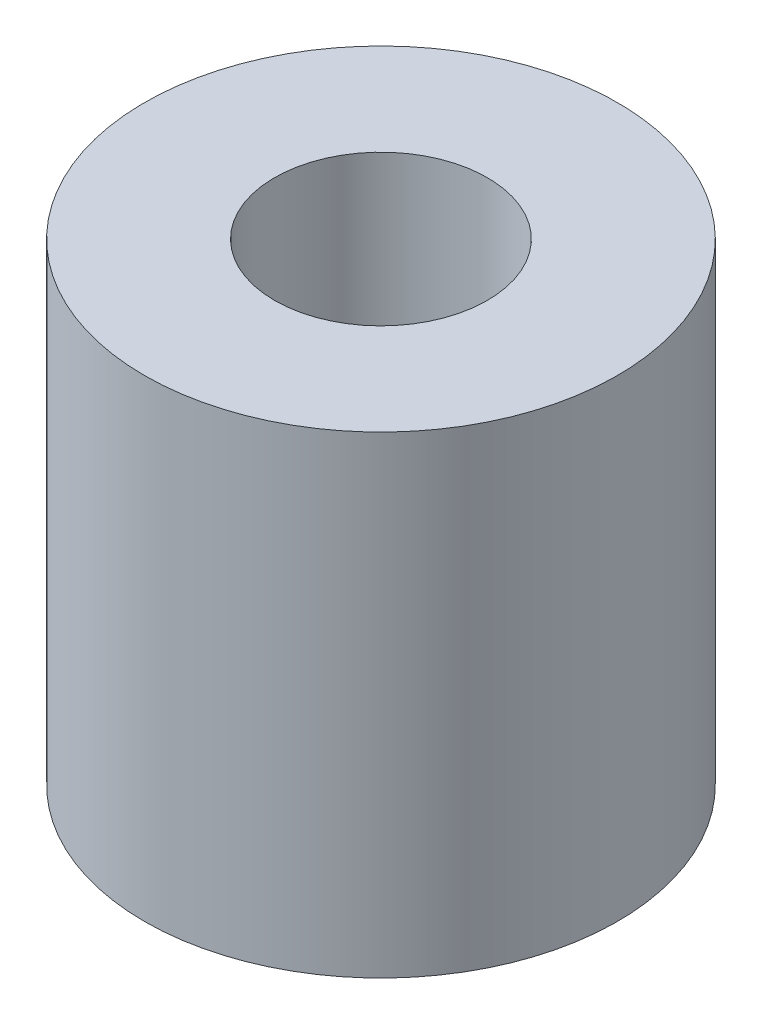
ISO-10303-21;
HEADER;
FILE_DESCRIPTION(('STEP AP214'),'2;1');
FILE_NAME('part.step','',(''),(''),'','','');
FILE_SCHEMA(('AUTOMOTIVE_DESIGN { 1 0 10303 214 1 1 1 1 }'));
ENDSEC;
DATA;
#1=APPLICATION_CONTEXT('core data for automotive mechanical design processes');
#2=APPLICATION_PROTOCOL_DEFINITION('international standard','automotive_design',2000,#1);
#3=PRODUCT_CONTEXT('',#1,'mechanical');
#4=PRODUCT('Part','Part','',(#3));
#5=PRODUCT_RELATED_PRODUCT_CATEGORY('part','',(#4));
#6=PRODUCT_DEFINITION_FORMATION('','',#4);
#7=PRODUCT_DEFINITION_CONTEXT('part definition',#1,'design');
#8=PRODUCT_DEFINITION('design','',#6,#7);
#9=PRODUCT_DEFINITION_SHAPE('','',#8);
#10=(LENGTH_UNIT() NAMED_UNIT(*) SI_UNIT(.MILLI.,.METRE.));
#11=(NAMED_UNIT(*) PLANE_ANGLE_UNIT() SI_UNIT($,.RADIAN.));
#12=(NAMED_UNIT(*) SI_UNIT($,.STERADIAN.) SOLID_ANGLE_UNIT());
#13=UNCERTAINTY_MEASURE_WITH_UNIT(LENGTH_MEASURE(1.E-05),#10,'distance_accuracy_value','');
#14=(GEOMETRIC_REPRESENTATION_CONTEXT(3) GLOBAL_UNCERTAINTY_ASSIGNED_CONTEXT((#13)) GLOBAL_UNIT_ASSIGNED_CONTEXT((#10,
#11,#12)) REPRESENTATION_CONTEXT('',''));
#15=CARTESIAN_POINT('',(0.,0.,0.));
#16=DIRECTION('',(0.,0.,1.));
#17=DIRECTION('',(1.,0.,0.));
#18=AXIS2_PLACEMENT_3D('',#15,#16,#17);
#19=CARTESIAN_POINT('',(0.,20.,0.));
#20=DIRECTION('',(0.,1.,0.));
#21=DIRECTION('',(0.,0.,1.));
#22=AXIS2_PLACEMENT_3D('',#19,#20,#21);
#23=PLANE('',#22);
#24=CARTESIAN_POINT('',(0.,20.,0.));
#25=DIRECTION('',(0.,1.,0.));
#26=DIRECTION('',(0.,0.,1.));
#27=AXIS2_PLACEMENT_3D('',#24,#25,#26);
#28=CIRCLE('',#27,10.);
#29=CARTESIAN_POINT('',(0.,20.,10.));
#30=VERTEX_POINT('',#29);
#31=EDGE_CURVE('E10',#30,#30,#28,.T.);
#32=ORIENTED_EDGE('',*,*,#31,.T.);
#33=EDGE_LOOP('',(#32));
#34=FACE_BOUND('',#33,.T.);
#35=CARTESIAN_POINT('',(0.,20.,0.));
#36=DIRECTION('',(0.,1.,0.));
#37=DIRECTION('',(0.,0.,1.));
#38=AXIS2_PLACEMENT_3D('',#35,#36,#37);
#39=CIRCLE('',#38,4.5);
#40=CARTESIAN_POINT('',(0.,20.,4.5));
#41=VERTEX_POINT('',#40);
#42=EDGE_CURVE('E56',#41,#41,#39,.T.);
#43=ORIENTED_EDGE('',*,*,#42,.F.);
#44=EDGE_LOOP('',(#43));
#45=FACE_BOUND('',#44,.T.);
#46=ADVANCED_FACE('F43',(#34,#45),#23,.T.);
#47=CARTESIAN_POINT('',(0.,0.,0.));
#48=DIRECTION('',(0.,1.,0.));
#49=DIRECTION('',(0.,0.,1.));
#50=AXIS2_PLACEMENT_3D('',#47,#48,#49);
#51=PLANE('',#50);
#52=CARTESIAN_POINT('',(-6.53202429229253,0.,3.1456571086023));
#53=DIRECTION('',(0.,-1.,0.));
#54=DIRECTION('',(0.,0.,-1.));
#55=AXIS2_PLACEMENT_3D('',#52,#53,#54);
#56=CIRCLE('',#55,0.999999999999999);
#57=CARTESIAN_POINT('',(-6.53202429229253,0.,2.1456571086023));
#58=VERTEX_POINT('',#57);
#59=EDGE_CURVE('E70',#58,#58,#56,.T.);
#60=ORIENTED_EDGE('',*,*,#59,.F.);
#61=EDGE_LOOP('',(#60));
#62=FACE_BOUND('',#61,.T.);
#63=CARTESIAN_POINT('',(-4.52030106347581,0.,5.66827824789323));
#64=DIRECTION('',(0.,-1.,0.));
#65=DIRECTION('',(0.,0.,-1.));
#66=AXIS2_PLACEMENT_3D('',#63,#64,#65);
#67=CIRCLE('',#66,1.);
#68=CARTESIAN_POINT('',(-4.52030106347581,0.,4.66827824789322));
#69=VERTEX_POINT('',#68);
#70=EDGE_CURVE('E127',#69,#69,#67,.T.);
#71=ORIENTED_EDGE('',*,*,#70,.F.);
#72=EDGE_LOOP('',(#71));
#73=FACE_BOUND('',#72,.T.);
#74=CARTESIAN_POINT('',(-1.61327677118326,0.,7.06822736331823));
#75=DIRECTION('',(0.,-1.,0.));
#76=DIRECTION('',(0.,0.,-1.));
#77=AXIS2_PLACEMENT_3D('',#74,#75,#76);
#78=CIRCLE('',#77,0.999999999999999);
#79=CARTESIAN_POINT('',(-1.61327677118326,0.,6.06822736331823));
#80=VERTEX_POINT('',#79);
#81=EDGE_CURVE('E119',#80,#80,#78,.T.);
#82=ORIENTED_EDGE('',*,*,#81,.F.);
#83=EDGE_LOOP('',(#82));
#84=FACE_BOUND('',#83,.T.);
#85=CARTESIAN_POINT('',(1.61327677118331,0.,7.06822736331821));
#86=DIRECTION('',(0.,-1.,0.));
#87=DIRECTION('',(0.,0.,-1.));
#88=AXIS2_PLACEMENT_3D('',#85,#86,#87);
#89=CIRCLE('',#88,0.999999999999999);
#90=CARTESIAN_POINT('',(1.61327677118331,0.,6.06822736331821));
#91=VERTEX_POINT('',#90);
#92=EDGE_CURVE('E111',#91,#91,#89,.T.);
#93=ORIENTED_EDGE('',*,*,#92,.F.);
#94=EDGE_LOOP('',(#93));
#95=FACE_BOUND('',#94,.T.);
#96=CARTESIAN_POINT('',(4.52030106347584,0.,5.66827824789319));
#97=DIRECTION('',(0.,-1.,0.));
#98=DIRECTION('',(0.,0.,-1.));
#99=AXIS2_PLACEMENT_3D('',#96,#97,#98);
#100=CIRCLE('',#99,0.999999999999999);
#101=CARTESIAN_POINT('',(4.52030106347584,0.,4.66827824789319));
#102=VERTEX_POINT('',#101);
#103=EDGE_CURVE('E103',#102,#102,#100,.T.);
#104=ORIENTED_EDGE('',*,*,#103,.F.);
#105=EDGE_LOOP('',(#104));
#106=FACE_BOUND('',#105,.T.);
#107=CARTESIAN_POINT('',(6.53202429229256,0.,3.14565710860226));
#108=DIRECTION('',(0.,-1.,0.));
#109=DIRECTION('',(0.,0.,-1.));
#110=AXIS2_PLACEMENT_3D('',#107,#108,#109);
#111=CIRCLE('',#110,1.);
#112=CARTESIAN_POINT('',(6.53202429229256,0.,2.14565710860226));
#113=VERTEX_POINT('',#112);
#114=EDGE_CURVE('E95',#113,#113,#111,.T.);
#115=ORIENTED_EDGE('',*,*,#114,.F.);
#116=EDGE_LOOP('',(#115));
#117=FACE_BOUND('',#116,.T.);
#118=CARTESIAN_POINT('',(7.25,0.,0.));
#119=DIRECTION('',(0.,-1.,0.));
#120=DIRECTION('',(0.,0.,-1.));
#121=AXIS2_PLACEMENT_3D('',#118,#119,#120);
#122=CIRCLE('',#121,0.999999999999999);
#123=CARTESIAN_POINT('',(7.25,0.,-1.00000000000005));
#124=VERTEX_POINT('',#123);
#125=EDGE_CURVE('E87',#124,#124,#122,.T.);
#126=ORIENTED_EDGE('',*,*,#125,.F.);
#127=EDGE_LOOP('',(#126));
#128=FACE_BOUND('',#127,.T.);
#129=CARTESIAN_POINT('',(6.53202429229251,0.,-3.14565710860235));
#130=DIRECTION('',(0.,-1.,0.));
#131=DIRECTION('',(0.,0.,-1.));
#132=AXIS2_PLACEMENT_3D('',#129,#130,#131);
#133=CIRCLE('',#132,0.999999999999999);
#134=CARTESIAN_POINT('',(6.53202429229251,0.,-4.14565710860235));
#135=VERTEX_POINT('',#134);
#136=EDGE_CURVE('E78',#135,#135,#133,.T.);
#137=ORIENTED_EDGE('',*,*,#136,.F.);
#138=EDGE_LOOP('',(#137));
#139=FACE_BOUND('',#138,.T.);
#140=CARTESIAN_POINT('',(4.52030106347577,0.,-5.66827824789325));
#141=DIRECTION('',(0.,-1.,0.));
#142=DIRECTION('',(0.,0.,-1.));
#143=AXIS2_PLACEMENT_3D('',#140,#141,#142);
#144=CIRCLE('',#143,1.);
#145=CARTESIAN_POINT('',(4.52030106347577,0.,-6.66827824789325));
#146=VERTEX_POINT('',#145);
#147=EDGE_CURVE('E79',#146,#146,#144,.T.);
#148=ORIENTED_EDGE('',*,*,#147,.F.);
#149=EDGE_LOOP('',(#148));
#150=FACE_BOUND('',#149,.T.);
#151=CARTESIAN_POINT('',(1.61327677118321,0.,-7.06822736331824));
#152=DIRECTION('',(0.,-1.,0.));
#153=DIRECTION('',(0.,0.,-1.));
#154=AXIS2_PLACEMENT_3D('',#151,#152,#153);
#155=CIRCLE('',#154,1.);
#156=CARTESIAN_POINT('',(1.61327677118321,0.,-8.06822736331824));
#157=VERTEX_POINT('',#156);
#158=EDGE_CURVE('E166',#157,#157,#155,.T.);
#159=ORIENTED_EDGE('',*,*,#158,.F.);
#160=EDGE_LOOP('',(#159));
#161=FACE_BOUND('',#160,.T.);
#162=CARTESIAN_POINT('',(-1.61327677118335,0.,-7.0682273633182));
#163=DIRECTION('',(0.,-1.,0.));
#164=DIRECTION('',(0.,0.,-1.));
#165=AXIS2_PLACEMENT_3D('',#162,#163,#164);
#166=CIRCLE('',#165,1.);
#167=CARTESIAN_POINT('',(-1.61327677118335,0.,-8.0682273633182));
#168=VERTEX_POINT('',#167);
#169=EDGE_CURVE('E158',#168,#168,#166,.T.);
#170=ORIENTED_EDGE('',*,*,#169,.F.);
#171=EDGE_LOOP('',(#170));
#172=FACE_BOUND('',#171,.T.);
#173=CARTESIAN_POINT('',(-4.52030106347589,0.,-5.66827824789316));
#174=DIRECTION('',(0.,-1.,0.));
#175=DIRECTION('',(0.,0.,-1.));
#176=AXIS2_PLACEMENT_3D('',#173,#174,#175);
#177=CIRCLE('',#176,0.999999999999998);
#178=CARTESIAN_POINT('',(-4.52030106347589,0.,-6.66827824789316));
#179=VERTEX_POINT('',#178);
#180=EDGE_CURVE('E150',#179,#179,#177,.T.);
#181=ORIENTED_EDGE('',*,*,#180,.F.);
#182=EDGE_LOOP('',(#181));
#183=FACE_BOUND('',#182,.T.);
#184=CARTESIAN_POINT('',(-6.53202429229258,0.,-3.14565710860221));
#185=DIRECTION('',(0.,-1.,0.));
#186=DIRECTION('',(0.,0.,-1.));
#187=AXIS2_PLACEMENT_3D('',#184,#185,#186);
#188=CIRCLE('',#187,0.999999999999999);
#189=CARTESIAN_POINT('',(-6.53202429229258,0.,-4.14565710860221));
#190=VERTEX_POINT('',#189);
#191=EDGE_CURVE('E142',#190,#190,#188,.T.);
#192=ORIENTED_EDGE('',*,*,#191,.F.);
#193=EDGE_LOOP('',(#192));
#194=FACE_BOUND('',#193,.T.);
#195=CARTESIAN_POINT('',(-7.25,0.,0.));
#196=DIRECTION('',(0.,-1.,0.));
#197=DIRECTION('',(0.,0.,-1.));
#198=AXIS2_PLACEMENT_3D('',#195,#196,#197);
#199=CIRCLE('',#198,1.);
#200=CARTESIAN_POINT('',(-7.25,0.,-1.));
#201=VERTEX_POINT('',#200);
#202=EDGE_CURVE('E66',#201,#201,#199,.T.);
#203=ORIENTED_EDGE('',*,*,#202,.F.);
#204=EDGE_LOOP('',(#203));
#205=FACE_BOUND('',#204,.T.);
#206=CARTESIAN_POINT('',(0.,0.,0.));
#207=DIRECTION('',(0.,1.,0.));
#208=DIRECTION('',(0.,0.,1.));
#209=AXIS2_PLACEMENT_3D('',#206,#207,#208);
#210=CIRCLE('',#209,10.);
#211=CARTESIAN_POINT('',(0.,0.,10.));
#212=VERTEX_POINT('',#211);
#213=EDGE_CURVE('E47',#212,#212,#210,.T.);
#214=ORIENTED_EDGE('',*,*,#213,.F.);
#215=EDGE_LOOP('',(#214));
#216=FACE_BOUND('',#215,.T.);
#217=CARTESIAN_POINT('',(0.,0.,0.));
#218=DIRECTION('',(0.,1.,0.));
#219=DIRECTION('',(0.,0.,1.));
#220=AXIS2_PLACEMENT_3D('',#217,#218,#219);
#221=CIRCLE('',#220,4.5);
#222=CARTESIAN_POINT('',(0.,0.,4.5));
#223=VERTEX_POINT('',#222);
#224=EDGE_CURVE('E58',#223,#223,#221,.T.);
#225=ORIENTED_EDGE('',*,*,#224,.T.);
#226=EDGE_LOOP('',(#225));
#227=FACE_BOUND('',#226,.T.);
#228=ADVANCED_FACE('F180',(#62,#73,#84,#95,#106,#117,#128,#139,#150,#161,#172,#183,#194,#205,
#216,#227),#51,.F.);
#229=CARTESIAN_POINT('',(0.,20.,0.));
#230=DIRECTION('',(0.,-1.,0.));
#231=DIRECTION('',(0.,0.,-1.));
#232=AXIS2_PLACEMENT_3D('',#229,#230,#231);
#233=CYLINDRICAL_SURFACE('',#232,10.);
#234=ORIENTED_EDGE('',*,*,#31,.F.);
#235=EDGE_LOOP('',(#234));
#236=FACE_BOUND('',#235,.T.);
#237=ORIENTED_EDGE('',*,*,#213,.T.);
#238=EDGE_LOOP('',(#237));
#239=FACE_BOUND('',#238,.T.);
#240=ADVANCED_FACE('F45',(#236,#239),#233,.T.);
#241=CARTESIAN_POINT('',(0.,20.,0.));
#242=DIRECTION('',(0.,-1.,0.));
#243=DIRECTION('',(0.,0.,-1.));
#244=AXIS2_PLACEMENT_3D('',#241,#242,#243);
#245=CYLINDRICAL_SURFACE('',#244,4.5);
#246=ORIENTED_EDGE('',*,*,#42,.T.);
#247=EDGE_LOOP('',(#246));
#248=FACE_BOUND('',#247,.T.);
#249=ORIENTED_EDGE('',*,*,#224,.F.);
#250=EDGE_LOOP('',(#249));
#251=FACE_BOUND('',#250,.T.);
#252=ADVANCED_FACE('F198',(#248,#251),#245,.F.);
#253=CARTESIAN_POINT('',(-7.25,2.,0.));
#254=DIRECTION('',(0.,-1.,0.));
#255=DIRECTION('',(0.,0.,-1.));
#256=AXIS2_PLACEMENT_3D('',#253,#254,#255);
#257=CYLINDRICAL_SURFACE('',#256,1.);
#258=CARTESIAN_POINT('',(-7.25,2.,0.));
#259=DIRECTION('',(0.,-1.,0.));
#260=DIRECTION('',(0.,0.,-1.));
#261=AXIS2_PLACEMENT_3D('',#258,#259,#260);
#262=CIRCLE('',#261,1.);
#263=CARTESIAN_POINT('',(-7.25,2.,-1.));
#264=VERTEX_POINT('',#263);
#265=EDGE_CURVE('E62',#264,#264,#262,.T.);
#266=ORIENTED_EDGE('',*,*,#265,.F.);
#267=EDGE_LOOP('',(#266));
#268=FACE_BOUND('',#267,.T.);
#269=ORIENTED_EDGE('',*,*,#202,.T.);
#270=EDGE_LOOP('',(#269));
#271=FACE_BOUND('',#270,.T.);
#272=ADVANCED_FACE('F200',(#268,#271),#257,.F.);
#273=CARTESIAN_POINT('',(-7.25,2.,0.));
#274=DIRECTION('',(0.,-1.,0.));
#275=DIRECTION('',(0.,0.,-1.));
#276=AXIS2_PLACEMENT_3D('',#273,#274,#275);
#277=PLANE('',#276);
#278=ORIENTED_EDGE('',*,*,#265,.T.);
#279=EDGE_LOOP('',(#278));
#280=FACE_BOUND('',#279,.T.);
#281=ADVANCED_FACE('F207',(#280),#277,.T.);
#282=CARTESIAN_POINT('',(-6.53202429229258,2.,-3.14565710860221));
#283=DIRECTION('',(0.,-1.,0.));
#284=DIRECTION('',(0.,0.,-1.));
#285=AXIS2_PLACEMENT_3D('',#282,#283,#284);
#286=CYLINDRICAL_SURFACE('',#285,0.999999999999999);
#287=CARTESIAN_POINT('',(-6.53202429229258,2.,-3.14565710860221));
#288=DIRECTION('',(0.,-1.,0.));
#289=DIRECTION('',(0.,0.,-1.));
#290=AXIS2_PLACEMENT_3D('',#287,#288,#289);
#291=CIRCLE('',#290,0.999999999999999);
#292=CARTESIAN_POINT('',(-6.53202429229258,2.,-4.14565710860221));
#293=VERTEX_POINT('',#292);
#294=EDGE_CURVE('E138',#293,#293,#291,.T.);
#295=ORIENTED_EDGE('',*,*,#294,.F.);
#296=EDGE_LOOP('',(#295));
#297=FACE_BOUND('',#296,.T.);
#298=ORIENTED_EDGE('',*,*,#191,.T.);
#299=EDGE_LOOP('',(#298));
#300=FACE_BOUND('',#299,.T.);
#301=ADVANCED_FACE('F246',(#297,#300),#286,.F.);
#302=CARTESIAN_POINT('',(-6.53202429229258,2.,-3.14565710860221));
#303=DIRECTION('',(0.,-1.,0.));
#304=DIRECTION('',(0.,0.,-1.));
#305=AXIS2_PLACEMENT_3D('',#302,#303,#304);
#306=PLANE('',#305);
#307=ORIENTED_EDGE('',*,*,#294,.T.);
#308=EDGE_LOOP('',(#307));
#309=FACE_BOUND('',#308,.T.);
#310=ADVANCED_FACE('F256',(#309),#306,.T.);
#311=CARTESIAN_POINT('',(-4.52030106347589,2.,-5.66827824789316));
#312=DIRECTION('',(0.,-1.,0.));
#313=DIRECTION('',(0.,0.,-1.));
#314=AXIS2_PLACEMENT_3D('',#311,#312,#313);
#315=CYLINDRICAL_SURFACE('',#314,0.999999999999998);
#316=CARTESIAN_POINT('',(-4.52030106347589,2.,-5.66827824789316));
#317=DIRECTION('',(0.,-1.,0.));
#318=DIRECTION('',(0.,0.,-1.));
#319=AXIS2_PLACEMENT_3D('',#316,#317,#318);
#320=CIRCLE('',#319,0.999999999999998);
#321=CARTESIAN_POINT('',(-4.52030106347589,2.,-6.66827824789316));
#322=VERTEX_POINT('',#321);
#323=EDGE_CURVE('E146',#322,#322,#320,.T.);
#324=ORIENTED_EDGE('',*,*,#323,.F.);
#325=EDGE_LOOP('',(#324));
#326=FACE_BOUND('',#325,.T.);
#327=ORIENTED_EDGE('',*,*,#180,.T.);
#328=EDGE_LOOP('',(#327));
#329=FACE_BOUND('',#328,.T.);
#330=ADVANCED_FACE('F266',(#326,#329),#315,.F.);
#331=CARTESIAN_POINT('',(-4.52030106347589,2.,-5.66827824789316));
#332=DIRECTION('',(0.,-1.,0.));
#333=DIRECTION('',(0.,0.,-1.));
#334=AXIS2_PLACEMENT_3D('',#331,#332,#333);
#335=PLANE('',#334);
#336=ORIENTED_EDGE('',*,*,#323,.T.);
#337=EDGE_LOOP('',(#336));
#338=FACE_BOUND('',#337,.T.);
#339=ADVANCED_FACE('F276',(#338),#335,.T.);
#340=CARTESIAN_POINT('',(-1.61327677118335,2.,-7.0682273633182));
#341=DIRECTION('',(0.,-1.,0.));
#342=DIRECTION('',(0.,0.,-1.));
#343=AXIS2_PLACEMENT_3D('',#340,#341,#342);
#344=CYLINDRICAL_SURFACE('',#343,1.);
#345=CARTESIAN_POINT('',(-1.61327677118335,2.,-7.0682273633182));
#346=DIRECTION('',(0.,-1.,0.));
#347=DIRECTION('',(0.,0.,-1.));
#348=AXIS2_PLACEMENT_3D('',#345,#346,#347);
#349=CIRCLE('',#348,1.);
#350=CARTESIAN_POINT('',(-1.61327677118335,2.,-8.0682273633182));
#351=VERTEX_POINT('',#350);
#352=EDGE_CURVE('E154',#351,#351,#349,.T.);
#353=ORIENTED_EDGE('',*,*,#352,.F.);
#354=EDGE_LOOP('',(#353));
#355=FACE_BOUND('',#354,.T.);
#356=ORIENTED_EDGE('',*,*,#169,.T.);
#357=EDGE_LOOP('',(#356));
#358=FACE_BOUND('',#357,.T.);
#359=ADVANCED_FACE('F286',(#355,#358),#344,.F.);
#360=CARTESIAN_POINT('',(-1.61327677118335,2.,-7.0682273633182));
#361=DIRECTION('',(0.,-1.,0.));
#362=DIRECTION('',(0.,0.,-1.));
#363=AXIS2_PLACEMENT_3D('',#360,#361,#362);
#364=PLANE('',#363);
#365=ORIENTED_EDGE('',*,*,#352,.T.);
#366=EDGE_LOOP('',(#365));
#367=FACE_BOUND('',#366,.T.);
#368=ADVANCED_FACE('F296',(#367),#364,.T.);
#369=CARTESIAN_POINT('',(1.61327677118321,2.,-7.06822736331824));
#370=DIRECTION('',(0.,-1.,0.));
#371=DIRECTION('',(0.,0.,-1.));
#372=AXIS2_PLACEMENT_3D('',#369,#370,#371);
#373=CYLINDRICAL_SURFACE('',#372,1.);
#374=CARTESIAN_POINT('',(1.61327677118321,2.,-7.06822736331824));
#375=DIRECTION('',(0.,-1.,0.));
#376=DIRECTION('',(0.,0.,-1.));
#377=AXIS2_PLACEMENT_3D('',#374,#375,#376);
#378=CIRCLE('',#377,1.);
#379=CARTESIAN_POINT('',(1.61327677118321,2.,-8.06822736331824));
#380=VERTEX_POINT('',#379);
#381=EDGE_CURVE('E162',#380,#380,#378,.T.);
#382=ORIENTED_EDGE('',*,*,#381,.F.);
#383=EDGE_LOOP('',(#382));
#384=FACE_BOUND('',#383,.T.);
#385=ORIENTED_EDGE('',*,*,#158,.T.);
#386=EDGE_LOOP('',(#385));
#387=FACE_BOUND('',#386,.T.);
#388=ADVANCED_FACE('F306',(#384,#387),#373,.F.);
#389=CARTESIAN_POINT('',(1.61327677118321,2.,-7.06822736331824));
#390=DIRECTION('',(0.,-1.,0.));
#391=DIRECTION('',(0.,0.,-1.));
#392=AXIS2_PLACEMENT_3D('',#389,#390,#391);
#393=PLANE('',#392);
#394=ORIENTED_EDGE('',*,*,#381,.T.);
#395=EDGE_LOOP('',(#394));
#396=FACE_BOUND('',#395,.T.);
#397=ADVANCED_FACE('F316',(#396),#393,.T.);
#398=CARTESIAN_POINT('',(4.52030106347577,2.,-5.66827824789325));
#399=DIRECTION('',(0.,-1.,0.));
#400=DIRECTION('',(0.,0.,-1.));
#401=AXIS2_PLACEMENT_3D('',#398,#399,#400);
#402=CYLINDRICAL_SURFACE('',#401,1.);
#403=CARTESIAN_POINT('',(4.52030106347577,2.,-5.66827824789325));
#404=DIRECTION('',(0.,-1.,0.));
#405=DIRECTION('',(0.,0.,-1.));
#406=AXIS2_PLACEMENT_3D('',#403,#404,#405);
#407=CIRCLE('',#406,1.);
#408=CARTESIAN_POINT('',(4.52030106347577,2.,-6.66827824789325));
#409=VERTEX_POINT('',#408);
#410=EDGE_CURVE('E170',#409,#409,#407,.T.);
#411=ORIENTED_EDGE('',*,*,#410,.F.);
#412=EDGE_LOOP('',(#411));
#413=FACE_BOUND('',#412,.T.);
#414=ORIENTED_EDGE('',*,*,#147,.T.);
#415=EDGE_LOOP('',(#414));
#416=FACE_BOUND('',#415,.T.);
#417=ADVANCED_FACE('F178',(#413,#416),#402,.F.);
#418=CARTESIAN_POINT('',(4.52030106347577,2.,-5.66827824789325));
#419=DIRECTION('',(0.,-1.,0.));
#420=DIRECTION('',(0.,0.,-1.));
#421=AXIS2_PLACEMENT_3D('',#418,#419,#420);
#422=PLANE('',#421);
#423=ORIENTED_EDGE('',*,*,#410,.T.);
#424=EDGE_LOOP('',(#423));
#425=FACE_BOUND('',#424,.T.);
#426=ADVANCED_FACE('F335',(#425),#422,.T.);
#427=CARTESIAN_POINT('',(6.53202429229251,2.,-3.14565710860235));
#428=DIRECTION('',(0.,-1.,0.));
#429=DIRECTION('',(0.,0.,-1.));
#430=AXIS2_PLACEMENT_3D('',#427,#428,#429);
#431=CYLINDRICAL_SURFACE('',#430,0.999999999999999);
#432=CARTESIAN_POINT('',(6.53202429229251,2.,-3.14565710860235));
#433=DIRECTION('',(0.,-1.,0.));
#434=DIRECTION('',(0.,0.,-1.));
#435=AXIS2_PLACEMENT_3D('',#432,#433,#434);
#436=CIRCLE('',#435,0.999999999999999);
#437=CARTESIAN_POINT('',(6.53202429229251,2.,-4.14565710860235));
#438=VERTEX_POINT('',#437);
#439=EDGE_CURVE('E74',#438,#438,#436,.T.);
#440=ORIENTED_EDGE('',*,*,#439,.F.);
#441=EDGE_LOOP('',(#440));
#442=FACE_BOUND('',#441,.T.);
#443=ORIENTED_EDGE('',*,*,#136,.T.);
#444=EDGE_LOOP('',(#443));
#445=FACE_BOUND('',#444,.T.);
#446=ADVANCED_FACE('F345',(#442,#445),#431,.F.);
#447=CARTESIAN_POINT('',(6.53202429229251,2.,-3.14565710860235));
#448=DIRECTION('',(0.,-1.,0.));
#449=DIRECTION('',(0.,0.,-1.));
#450=AXIS2_PLACEMENT_3D('',#447,#448,#449);
#451=PLANE('',#450);
#452=ORIENTED_EDGE('',*,*,#439,.T.);
#453=EDGE_LOOP('',(#452));
#454=FACE_BOUND('',#453,.T.);
#455=ADVANCED_FACE('F355',(#454),#451,.T.);
#456=CARTESIAN_POINT('',(7.25,2.,0.));
#457=DIRECTION('',(0.,-1.,0.));
#458=DIRECTION('',(0.,0.,-1.));
#459=AXIS2_PLACEMENT_3D('',#456,#457,#458);
#460=CYLINDRICAL_SURFACE('',#459,0.999999999999999);
#461=CARTESIAN_POINT('',(7.25,2.,0.));
#462=DIRECTION('',(0.,-1.,0.));
#463=DIRECTION('',(0.,0.,-1.));
#464=AXIS2_PLACEMENT_3D('',#461,#462,#463);
#465=CIRCLE('',#464,0.999999999999999);
#466=CARTESIAN_POINT('',(7.25,2.,-1.00000000000005));
#467=VERTEX_POINT('',#466);
#468=EDGE_CURVE('E83',#467,#467,#465,.T.);
#469=ORIENTED_EDGE('',*,*,#468,.F.);
#470=EDGE_LOOP('',(#469));
#471=FACE_BOUND('',#470,.T.);
#472=ORIENTED_EDGE('',*,*,#125,.T.);
#473=EDGE_LOOP('',(#472));
#474=FACE_BOUND('',#473,.T.);
#475=ADVANCED_FACE('F365',(#471,#474),#460,.F.);
#476=CARTESIAN_POINT('',(7.25,2.,0.));
#477=DIRECTION('',(0.,-1.,0.));
#478=DIRECTION('',(0.,0.,-1.));
#479=AXIS2_PLACEMENT_3D('',#476,#477,#478);
#480=PLANE('',#479);
#481=ORIENTED_EDGE('',*,*,#468,.T.);
#482=EDGE_LOOP('',(#481));
#483=FACE_BOUND('',#482,.T.);
#484=ADVANCED_FACE('F375',(#483),#480,.T.);
#485=CARTESIAN_POINT('',(6.53202429229256,2.,3.14565710860226));
#486=DIRECTION('',(0.,-1.,0.));
#487=DIRECTION('',(0.,0.,-1.));
#488=AXIS2_PLACEMENT_3D('',#485,#486,#487);
#489=CYLINDRICAL_SURFACE('',#488,1.);
#490=CARTESIAN_POINT('',(6.53202429229256,2.,3.14565710860226));
#491=DIRECTION('',(0.,-1.,0.));
#492=DIRECTION('',(0.,0.,-1.));
#493=AXIS2_PLACEMENT_3D('',#490,#491,#492);
#494=CIRCLE('',#493,1.);
#495=CARTESIAN_POINT('',(6.53202429229256,2.,2.14565710860226));
#496=VERTEX_POINT('',#495);
#497=EDGE_CURVE('E91',#496,#496,#494,.T.);
#498=ORIENTED_EDGE('',*,*,#497,.F.);
#499=EDGE_LOOP('',(#498));
#500=FACE_BOUND('',#499,.T.);
#501=ORIENTED_EDGE('',*,*,#114,.T.);
#502=EDGE_LOOP('',(#501));
#503=FACE_BOUND('',#502,.T.);
#504=ADVANCED_FACE('F385',(#500,#503),#489,.F.);
#505=CARTESIAN_POINT('',(6.53202429229256,2.,3.14565710860226));
#506=DIRECTION('',(0.,-1.,0.));
#507=DIRECTION('',(0.,0.,-1.));
#508=AXIS2_PLACEMENT_3D('',#505,#506,#507);
#509=PLANE('',#508);
#510=ORIENTED_EDGE('',*,*,#497,.T.);
#511=EDGE_LOOP('',(#510));
#512=FACE_BOUND('',#511,.T.);
#513=ADVANCED_FACE('F395',(#512),#509,.T.);
#514=CARTESIAN_POINT('',(4.52030106347584,2.,5.66827824789319));
#515=DIRECTION('',(0.,-1.,0.));
#516=DIRECTION('',(0.,0.,-1.));
#517=AXIS2_PLACEMENT_3D('',#514,#515,#516);
#518=CYLINDRICAL_SURFACE('',#517,0.999999999999999);
#519=CARTESIAN_POINT('',(4.52030106347584,2.,5.66827824789319));
#520=DIRECTION('',(0.,-1.,0.));
#521=DIRECTION('',(0.,0.,-1.));
#522=AXIS2_PLACEMENT_3D('',#519,#520,#521);
#523=CIRCLE('',#522,0.999999999999999);
#524=CARTESIAN_POINT('',(4.52030106347584,2.,4.66827824789319));
#525=VERTEX_POINT('',#524);
#526=EDGE_CURVE('E99',#525,#525,#523,.T.);
#527=ORIENTED_EDGE('',*,*,#526,.F.);
#528=EDGE_LOOP('',(#527));
#529=FACE_BOUND('',#528,.T.);
#530=ORIENTED_EDGE('',*,*,#103,.T.);
#531=EDGE_LOOP('',(#530));
#532=FACE_BOUND('',#531,.T.);
#533=ADVANCED_FACE('F405',(#529,#532),#518,.F.);
#534=CARTESIAN_POINT('',(4.52030106347584,2.,5.66827824789319));
#535=DIRECTION('',(0.,-1.,0.));
#536=DIRECTION('',(0.,0.,-1.));
#537=AXIS2_PLACEMENT_3D('',#534,#535,#536);
#538=PLANE('',#537);
#539=ORIENTED_EDGE('',*,*,#526,.T.);
#540=EDGE_LOOP('',(#539));
#541=FACE_BOUND('',#540,.T.);
#542=ADVANCED_FACE('F415',(#541),#538,.T.);
#543=CARTESIAN_POINT('',(1.61327677118331,2.,7.06822736331821));
#544=DIRECTION('',(0.,-1.,0.));
#545=DIRECTION('',(0.,0.,-1.));
#546=AXIS2_PLACEMENT_3D('',#543,#544,#545);
#547=CYLINDRICAL_SURFACE('',#546,0.999999999999999);
#548=CARTESIAN_POINT('',(1.61327677118331,2.,7.06822736331821));
#549=DIRECTION('',(0.,-1.,0.));
#550=DIRECTION('',(0.,0.,-1.));
#551=AXIS2_PLACEMENT_3D('',#548,#549,#550);
#552=CIRCLE('',#551,0.999999999999999);
#553=CARTESIAN_POINT('',(1.61327677118331,2.,6.06822736331821));
#554=VERTEX_POINT('',#553);
#555=EDGE_CURVE('E107',#554,#554,#552,.T.);
#556=ORIENTED_EDGE('',*,*,#555,.F.);
#557=EDGE_LOOP('',(#556));
#558=FACE_BOUND('',#557,.T.);
#559=ORIENTED_EDGE('',*,*,#92,.T.);
#560=EDGE_LOOP('',(#559));
#561=FACE_BOUND('',#560,.T.);
#562=ADVANCED_FACE('F425',(#558,#561),#547,.F.);
#563=CARTESIAN_POINT('',(1.61327677118331,2.,7.06822736331821));
#564=DIRECTION('',(0.,-1.,0.));
#565=DIRECTION('',(0.,0.,-1.));
#566=AXIS2_PLACEMENT_3D('',#563,#564,#565);
#567=PLANE('',#566);
#568=ORIENTED_EDGE('',*,*,#555,.T.);
#569=EDGE_LOOP('',(#568));
#570=FACE_BOUND('',#569,.T.);
#571=ADVANCED_FACE('F435',(#570),#567,.T.);
#572=CARTESIAN_POINT('',(-1.61327677118326,2.,7.06822736331823));
#573=DIRECTION('',(0.,-1.,0.));
#574=DIRECTION('',(0.,0.,-1.));
#575=AXIS2_PLACEMENT_3D('',#572,#573,#574);
#576=CYLINDRICAL_SURFACE('',#575,0.999999999999999);
#577=CARTESIAN_POINT('',(-1.61327677118326,2.,7.06822736331823));
#578=DIRECTION('',(0.,-1.,0.));
#579=DIRECTION('',(0.,0.,-1.));
#580=AXIS2_PLACEMENT_3D('',#577,#578,#579);
#581=CIRCLE('',#580,0.999999999999999);
#582=CARTESIAN_POINT('',(-1.61327677118326,2.,6.06822736331823));
#583=VERTEX_POINT('',#582);
#584=EDGE_CURVE('E115',#583,#583,#581,.T.);
#585=ORIENTED_EDGE('',*,*,#584,.F.);
#586=EDGE_LOOP('',(#585));
#587=FACE_BOUND('',#586,.T.);
#588=ORIENTED_EDGE('',*,*,#81,.T.);
#589=EDGE_LOOP('',(#588));
#590=FACE_BOUND('',#589,.T.);
#591=ADVANCED_FACE('F445',(#587,#590),#576,.F.);
#592=CARTESIAN_POINT('',(-1.61327677118326,2.,7.06822736331823));
#593=DIRECTION('',(0.,-1.,0.));
#594=DIRECTION('',(0.,0.,-1.));
#595=AXIS2_PLACEMENT_3D('',#592,#593,#594);
#596=PLANE('',#595);
#597=ORIENTED_EDGE('',*,*,#584,.T.);
#598=EDGE_LOOP('',(#597));
#599=FACE_BOUND('',#598,.T.);
#600=ADVANCED_FACE('F455',(#599),#596,.T.);
#601=CARTESIAN_POINT('',(-4.52030106347581,2.,5.66827824789323));
#602=DIRECTION('',(0.,-1.,0.));
#603=DIRECTION('',(0.,0.,-1.));
#604=AXIS2_PLACEMENT_3D('',#601,#602,#603);
#605=CYLINDRICAL_SURFACE('',#604,1.);
#606=CARTESIAN_POINT('',(-4.52030106347581,2.,5.66827824789323));
#607=DIRECTION('',(0.,-1.,0.));
#608=DIRECTION('',(0.,0.,-1.));
#609=AXIS2_PLACEMENT_3D('',#606,#607,#608);
#610=CIRCLE('',#609,1.);
#611=CARTESIAN_POINT('',(-4.52030106347581,2.,4.66827824789322));
#612=VERTEX_POINT('',#611);
#613=EDGE_CURVE('E123',#612,#612,#610,.T.);
#614=ORIENTED_EDGE('',*,*,#613,.F.);
#615=EDGE_LOOP('',(#614));
#616=FACE_BOUND('',#615,.T.);
#617=ORIENTED_EDGE('',*,*,#70,.T.);
#618=EDGE_LOOP('',(#617));
#619=FACE_BOUND('',#618,.T.);
#620=ADVANCED_FACE('F465',(#616,#619),#605,.F.);
#621=CARTESIAN_POINT('',(-4.52030106347581,2.,5.66827824789323));
#622=DIRECTION('',(0.,-1.,0.));
#623=DIRECTION('',(0.,0.,-1.));
#624=AXIS2_PLACEMENT_3D('',#621,#622,#623);
#625=PLANE('',#624);
#626=ORIENTED_EDGE('',*,*,#613,.T.);
#627=EDGE_LOOP('',(#626));
#628=FACE_BOUND('',#627,.T.);
#629=ADVANCED_FACE('F475',(#628),#625,.T.);
#630=CARTESIAN_POINT('',(-6.53202429229253,2.,3.1456571086023));
#631=DIRECTION('',(0.,-1.,0.));
#632=DIRECTION('',(0.,0.,-1.));
#633=AXIS2_PLACEMENT_3D('',#630,#631,#632);
#634=CYLINDRICAL_SURFACE('',#633,0.999999999999999);
#635=CARTESIAN_POINT('',(-6.53202429229253,2.,3.1456571086023));
#636=DIRECTION('',(0.,-1.,0.));
#637=DIRECTION('',(0.,0.,-1.));
#638=AXIS2_PLACEMENT_3D('',#635,#636,#637);
#639=CIRCLE('',#638,0.999999999999999);
#640=CARTESIAN_POINT('',(-6.53202429229253,2.,2.1456571086023));
#641=VERTEX_POINT('',#640);
#642=EDGE_CURVE('E131',#641,#641,#639,.T.);
#643=ORIENTED_EDGE('',*,*,#642,.F.);
#644=EDGE_LOOP('',(#643));
#645=FACE_BOUND('',#644,.T.);
#646=ORIENTED_EDGE('',*,*,#59,.T.);
#647=EDGE_LOOP('',(#646));
#648=FACE_BOUND('',#647,.T.);
#649=ADVANCED_FACE('F485',(#645,#648),#634,.F.);
#650=CARTESIAN_POINT('',(-6.53202429229253,2.,3.1456571086023));
#651=DIRECTION('',(0.,-1.,0.));
#652=DIRECTION('',(0.,0.,-1.));
#653=AXIS2_PLACEMENT_3D('',#650,#651,#652);
#654=PLANE('',#653);
#655=ORIENTED_EDGE('',*,*,#642,.T.);
#656=EDGE_LOOP('',(#655));
#657=FACE_BOUND('',#656,.T.);
#658=ADVANCED_FACE('F495',(#657),#654,.T.);
#659=CLOSED_SHELL('',(#46,#228,#240,#252,#272,#281,#301,#310,#330,#339,#359,#368,#388,#397,#417,
#426,#446,#455,#475,#484,#504,#513,#533,#542,#562,#571,#591,#600,#620,#629,#649,#658));
#660=MANIFOLD_SOLID_BREP('B2',#659);
#661=ADVANCED_BREP_SHAPE_REPRESENTATION('',(#18,#660),#14);
#662=SHAPE_DEFINITION_REPRESENTATION(#9,#661);
ENDSEC;
END-ISO-10303-21;
